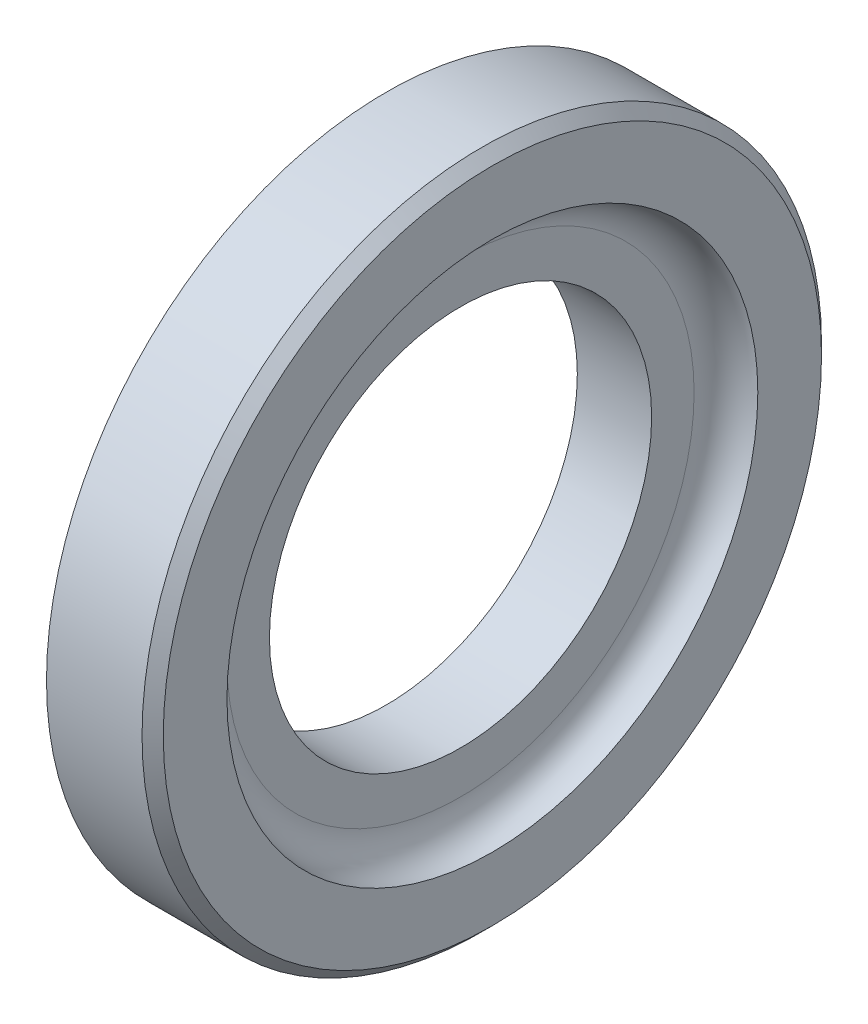
ISO-10303-21;
HEADER;
FILE_DESCRIPTION(('STEP AP214'),'2;1');
FILE_NAME('part.step','',(''),(''),'','','');
FILE_SCHEMA(('AUTOMOTIVE_DESIGN { 1 0 10303 214 1 1 1 1 }'));
ENDSEC;
DATA;
#1=APPLICATION_CONTEXT('core data for automotive mechanical design processes');
#2=APPLICATION_PROTOCOL_DEFINITION('international standard','automotive_design',2000,#1);
#3=PRODUCT_CONTEXT('',#1,'mechanical');
#4=PRODUCT('Part','Part','',(#3));
#5=PRODUCT_RELATED_PRODUCT_CATEGORY('part','',(#4));
#6=PRODUCT_DEFINITION_FORMATION('','',#4);
#7=PRODUCT_DEFINITION_CONTEXT('part definition',#1,'design');
#8=PRODUCT_DEFINITION('design','',#6,#7);
#9=PRODUCT_DEFINITION_SHAPE('','',#8);
#10=(LENGTH_UNIT() NAMED_UNIT(*) SI_UNIT(.MILLI.,.METRE.));
#11=(NAMED_UNIT(*) PLANE_ANGLE_UNIT() SI_UNIT($,.RADIAN.));
#12=(NAMED_UNIT(*) SI_UNIT($,.STERADIAN.) SOLID_ANGLE_UNIT());
#13=UNCERTAINTY_MEASURE_WITH_UNIT(LENGTH_MEASURE(1.E-05),#10,'distance_accuracy_value','');
#14=(GEOMETRIC_REPRESENTATION_CONTEXT(3) GLOBAL_UNCERTAINTY_ASSIGNED_CONTEXT((#13)) GLOBAL_UNIT_ASSIGNED_CONTEXT((#10,
#11,#12)) REPRESENTATION_CONTEXT('',''));
#15=CARTESIAN_POINT('',(0.,0.,0.));
#16=DIRECTION('',(0.,0.,1.));
#17=DIRECTION('',(1.,0.,0.));
#18=AXIS2_PLACEMENT_3D('',#15,#16,#17);
#19=CARTESIAN_POINT('',(0.,0.,0.));
#20=DIRECTION('',(1.,0.,0.));
#21=DIRECTION('',(0.,0.,-1.));
#22=AXIS2_PLACEMENT_3D('',#19,#20,#21);
#23=PLANE('',#22);
#24=CARTESIAN_POINT('',(0.,0.,0.));
#25=DIRECTION('',(1.,0.,0.));
#26=DIRECTION('',(0.,0.,-1.));
#27=AXIS2_PLACEMENT_3D('',#24,#25,#26);
#28=CIRCLE('',#27,31.);
#29=CARTESIAN_POINT('',(0.,0.,-31.));
#30=VERTEX_POINT('',#29);
#31=EDGE_CURVE('E61',#30,#30,#28,.T.);
#32=ORIENTED_EDGE('',*,*,#31,.T.);
#33=EDGE_LOOP('',(#32));
#34=FACE_BOUND('',#33,.T.);
#35=CARTESIAN_POINT('',(0.,0.,0.));
#36=DIRECTION('',(1.,0.,0.));
#37=DIRECTION('',(0.,0.,-1.));
#38=AXIS2_PLACEMENT_3D('',#35,#36,#37);
#39=CIRCLE('',#38,25.);
#40=CARTESIAN_POINT('',(0.,0.,-25.));
#41=VERTEX_POINT('',#40);
#42=EDGE_CURVE('E115',#41,#41,#39,.T.);
#43=ORIENTED_EDGE('',*,*,#42,.F.);
#44=EDGE_LOOP('',(#43));
#45=FACE_BOUND('',#44,.T.);
#46=ADVANCED_FACE('F51',(#34,#45),#23,.T.);
#47=CARTESIAN_POINT('',(0.,0.,0.));
#48=DIRECTION('',(1.,0.,0.));
#49=DIRECTION('',(0.,0.,-1.));
#50=AXIS2_PLACEMENT_3D('',#47,#48,#49);
#51=CYLINDRICAL_SURFACE('',#50,32.);
#52=CARTESIAN_POINT('',(-1.00000000000004,0.,0.));
#53=DIRECTION('',(1.,0.,0.));
#54=DIRECTION('',(0.,0.,-1.));
#55=AXIS2_PLACEMENT_3D('',#52,#53,#54);
#56=CIRCLE('',#55,32.);
#57=CARTESIAN_POINT('',(-1.00000000000004,0.,-32.));
#58=VERTEX_POINT('',#57);
#59=EDGE_CURVE('E11',#58,#58,#56,.F.);
#60=ORIENTED_EDGE('',*,*,#59,.T.);
#61=EDGE_LOOP('',(#60));
#62=FACE_BOUND('',#61,.T.);
#63=CARTESIAN_POINT('',(-10.,0.,0.));
#64=DIRECTION('',(1.,0.,0.));
#65=DIRECTION('',(0.,0.,-1.));
#66=AXIS2_PLACEMENT_3D('',#63,#64,#65);
#67=CIRCLE('',#66,32.);
#68=CARTESIAN_POINT('',(-10.,0.,-32.));
#69=VERTEX_POINT('',#68);
#70=EDGE_CURVE('E119',#69,#69,#67,.T.);
#71=ORIENTED_EDGE('',*,*,#70,.T.);
#72=EDGE_LOOP('',(#71));
#73=FACE_BOUND('',#72,.T.);
#74=ADVANCED_FACE('F144',(#62,#73),#51,.T.);
#75=CARTESIAN_POINT('',(-10.,0.,0.));
#76=DIRECTION('',(-1.,0.,0.));
#77=DIRECTION('',(0.,0.,1.));
#78=AXIS2_PLACEMENT_3D('',#75,#76,#77);
#79=PLANE('',#78);
#80=CARTESIAN_POINT('',(-10.,0.,25.));
#81=DIRECTION('',(-1.,0.,0.));
#82=DIRECTION('',(0.,-1.,0.));
#83=AXIS2_PLACEMENT_3D('',#80,#81,#82);
#84=CIRCLE('',#83,1.5);
#85=CARTESIAN_POINT('',(-10.,-1.50000000000009,25.));
#86=VERTEX_POINT('',#85);
#87=EDGE_CURVE('E200',#86,#86,#84,.T.);
#88=ORIENTED_EDGE('',*,*,#87,.F.);
#89=EDGE_LOOP('',(#88));
#90=FACE_BOUND('',#89,.T.);
#91=CARTESIAN_POINT('',(-10.,-25.,0.));
#92=DIRECTION('',(-1.,0.,0.));
#93=DIRECTION('',(0.,0.,-1.));
#94=AXIS2_PLACEMENT_3D('',#91,#92,#93);
#95=CIRCLE('',#94,1.5);
#96=CARTESIAN_POINT('',(-10.,-25.,-1.5));
#97=VERTEX_POINT('',#96);
#98=EDGE_CURVE('E85',#97,#97,#95,.T.);
#99=ORIENTED_EDGE('',*,*,#98,.F.);
#100=EDGE_LOOP('',(#99));
#101=FACE_BOUND('',#100,.T.);
#102=CARTESIAN_POINT('',(-10.,2.61861100413235E-13,-25.));
#103=DIRECTION('',(-1.,0.,0.));
#104=DIRECTION('',(0.,1.,0.));
#105=AXIS2_PLACEMENT_3D('',#102,#103,#104);
#106=CIRCLE('',#105,1.5);
#107=CARTESIAN_POINT('',(-10.,1.50000000000026,-25.));
#108=VERTEX_POINT('',#107);
#109=EDGE_CURVE('E86',#108,#108,#106,.T.);
#110=ORIENTED_EDGE('',*,*,#109,.F.);
#111=EDGE_LOOP('',(#110));
#112=FACE_BOUND('',#111,.T.);
#113=CARTESIAN_POINT('',(-10.,25.,0.));
#114=DIRECTION('',(-1.,0.,0.));
#115=DIRECTION('',(0.,0.,1.));
#116=AXIS2_PLACEMENT_3D('',#113,#114,#115);
#117=CIRCLE('',#116,1.5);
#118=CARTESIAN_POINT('',(-10.,25.,1.5));
#119=VERTEX_POINT('',#118);
#120=EDGE_CURVE('E98',#119,#119,#117,.T.);
#121=ORIENTED_EDGE('',*,*,#120,.F.);
#122=EDGE_LOOP('',(#121));
#123=FACE_BOUND('',#122,.T.);
#124=CARTESIAN_POINT('',(-10.,0.,0.));
#125=DIRECTION('',(1.,0.,0.));
#126=DIRECTION('',(0.,0.,-1.));
#127=AXIS2_PLACEMENT_3D('',#124,#125,#126);
#128=CIRCLE('',#127,18.);
#129=CARTESIAN_POINT('',(-10.,0.,-18.));
#130=VERTEX_POINT('',#129);
#131=EDGE_CURVE('E107',#130,#130,#128,.T.);
#132=ORIENTED_EDGE('',*,*,#131,.T.);
#133=EDGE_LOOP('',(#132));
#134=FACE_BOUND('',#133,.T.);
#135=ORIENTED_EDGE('',*,*,#70,.F.);
#136=EDGE_LOOP('',(#135));
#137=FACE_BOUND('',#136,.T.);
#138=ADVANCED_FACE('F149',(#90,#101,#112,#123,#134,#137),#79,.T.);
#139=CARTESIAN_POINT('',(-3.00000000000001,25.,0.));
#140=DIRECTION('',(-1.,0.,0.));
#141=DIRECTION('',(0.,0.,1.));
#142=AXIS2_PLACEMENT_3D('',#139,#140,#141);
#143=PLANE('',#142);
#144=CARTESIAN_POINT('',(-3.00000000000001,0.,0.));
#145=DIRECTION('',(-1.,0.,0.));
#146=DIRECTION('',(0.,0.,1.));
#147=AXIS2_PLACEMENT_3D('',#144,#145,#146);
#148=CIRCLE('',#147,22.);
#149=CARTESIAN_POINT('',(-3.00000000000001,0.,22.));
#150=VERTEX_POINT('',#149);
#151=EDGE_CURVE('E123',#150,#150,#148,.F.);
#152=ORIENTED_EDGE('',*,*,#151,.T.);
#153=EDGE_LOOP('',(#152));
#154=FACE_BOUND('',#153,.T.);
#155=CARTESIAN_POINT('',(-3.00000000000001,0.,0.));
#156=DIRECTION('',(1.,0.,0.));
#157=DIRECTION('',(0.,0.,-1.));
#158=AXIS2_PLACEMENT_3D('',#155,#156,#157);
#159=CIRCLE('',#158,18.);
#160=CARTESIAN_POINT('',(-3.00000000000001,0.,-18.));
#161=VERTEX_POINT('',#160);
#162=EDGE_CURVE('E111',#161,#161,#159,.T.);
#163=ORIENTED_EDGE('',*,*,#162,.F.);
#164=EDGE_LOOP('',(#163));
#165=FACE_BOUND('',#164,.T.);
#166=ADVANCED_FACE('F163',(#154,#165),#143,.F.);
#167=CARTESIAN_POINT('',(0.,0.,0.));
#168=DIRECTION('',(1.,0.,0.));
#169=DIRECTION('',(0.,0.,-1.));
#170=AXIS2_PLACEMENT_3D('',#167,#168,#169);
#171=CYLINDRICAL_SURFACE('',#170,18.);
#172=ORIENTED_EDGE('',*,*,#131,.F.);
#173=EDGE_LOOP('',(#172));
#174=FACE_BOUND('',#173,.T.);
#175=ORIENTED_EDGE('',*,*,#162,.T.);
#176=EDGE_LOOP('',(#175));
#177=FACE_BOUND('',#176,.T.);
#178=ADVANCED_FACE('F156',(#174,#177),#171,.F.);
#179=CARTESIAN_POINT('',(0.,0.,0.));
#180=DIRECTION('',(-1.,0.,0.));
#181=DIRECTION('',(0.,0.,1.));
#182=AXIS2_PLACEMENT_3D('',#179,#180,#181);
#183=TOROIDAL_SURFACE('',#182,22.,3.);
#184=ORIENTED_EDGE('',*,*,#42,.T.);
#185=EDGE_LOOP('',(#184));
#186=FACE_BOUND('',#185,.T.);
#187=ORIENTED_EDGE('',*,*,#151,.F.);
#188=EDGE_LOOP('',(#187));
#189=FACE_BOUND('',#188,.T.);
#190=ADVANCED_FACE('F153',(#186,#189),#183,.F.);
#191=CARTESIAN_POINT('',(-7.,25.,0.));
#192=DIRECTION('',(-1.,0.,0.));
#193=DIRECTION('',(0.,0.,1.));
#194=AXIS2_PLACEMENT_3D('',#191,#192,#193);
#195=CONICAL_SURFACE('',#194,1.5,1.02974425867665);
#196=CARTESIAN_POINT('',(-6.09870907145866,25.,0.));
#197=VERTEX_POINT('',#196);
#198=VERTEX_LOOP('',#197);
#199=FACE_BOUND('',#198,.T.);
#200=CARTESIAN_POINT('',(-7.,25.,0.));
#201=DIRECTION('',(-1.,0.,0.));
#202=DIRECTION('',(0.,0.,1.));
#203=AXIS2_PLACEMENT_3D('',#200,#201,#202);
#204=CIRCLE('',#203,1.5);
#205=CARTESIAN_POINT('',(-7.,25.,1.5));
#206=VERTEX_POINT('',#205);
#207=EDGE_CURVE('E102',#206,#206,#204,.T.);
#208=ORIENTED_EDGE('',*,*,#207,.T.);
#209=EDGE_LOOP('',(#208));
#210=FACE_BOUND('',#209,.T.);
#211=ADVANCED_FACE('F155',(#199,#210),#195,.F.);
#212=CARTESIAN_POINT('',(-10.,25.,0.));
#213=DIRECTION('',(-1.,0.,0.));
#214=DIRECTION('',(0.,0.,1.));
#215=AXIS2_PLACEMENT_3D('',#212,#213,#214);
#216=CYLINDRICAL_SURFACE('',#215,1.5);
#217=ORIENTED_EDGE('',*,*,#207,.F.);
#218=EDGE_LOOP('',(#217));
#219=FACE_BOUND('',#218,.T.);
#220=ORIENTED_EDGE('',*,*,#120,.T.);
#221=EDGE_LOOP('',(#220));
#222=FACE_BOUND('',#221,.T.);
#223=ADVANCED_FACE('F78',(#219,#222),#216,.F.);
#224=CARTESIAN_POINT('',(-7.,2.61861100413235E-13,-25.));
#225=DIRECTION('',(-1.,0.,0.));
#226=DIRECTION('',(0.,1.,0.));
#227=AXIS2_PLACEMENT_3D('',#224,#225,#226);
#228=CONICAL_SURFACE('',#227,1.5,1.02974425867665);
#229=CARTESIAN_POINT('',(-6.09870907145866,2.61861100413235E-13,-25.));
#230=VERTEX_POINT('',#229);
#231=VERTEX_LOOP('',#230);
#232=FACE_BOUND('',#231,.T.);
#233=CARTESIAN_POINT('',(-7.,2.61861100413235E-13,-25.));
#234=DIRECTION('',(-1.,0.,0.));
#235=DIRECTION('',(0.,1.,0.));
#236=AXIS2_PLACEMENT_3D('',#233,#234,#235);
#237=CIRCLE('',#236,1.5);
#238=CARTESIAN_POINT('',(-7.,1.50000000000026,-25.));
#239=VERTEX_POINT('',#238);
#240=EDGE_CURVE('E82',#239,#239,#237,.T.);
#241=ORIENTED_EDGE('',*,*,#240,.T.);
#242=EDGE_LOOP('',(#241));
#243=FACE_BOUND('',#242,.T.);
#244=ADVANCED_FACE('F74',(#232,#243),#228,.F.);
#245=CARTESIAN_POINT('',(-10.,2.61861100413235E-13,-25.));
#246=DIRECTION('',(-1.,0.,0.));
#247=DIRECTION('',(0.,1.,0.));
#248=AXIS2_PLACEMENT_3D('',#245,#246,#247);
#249=CYLINDRICAL_SURFACE('',#248,1.5);
#250=ORIENTED_EDGE('',*,*,#240,.F.);
#251=EDGE_LOOP('',(#250));
#252=FACE_BOUND('',#251,.T.);
#253=ORIENTED_EDGE('',*,*,#109,.T.);
#254=EDGE_LOOP('',(#253));
#255=FACE_BOUND('',#254,.T.);
#256=ADVANCED_FACE('F77',(#252,#255),#249,.F.);
#257=CARTESIAN_POINT('',(-7.,-25.,0.));
#258=DIRECTION('',(-1.,0.,0.));
#259=DIRECTION('',(0.,0.,-1.));
#260=AXIS2_PLACEMENT_3D('',#257,#258,#259);
#261=CONICAL_SURFACE('',#260,1.5,1.02974425867665);
#262=CARTESIAN_POINT('',(-6.09870907145866,-25.,0.));
#263=VERTEX_POINT('',#262);
#264=VERTEX_LOOP('',#263);
#265=FACE_BOUND('',#264,.T.);
#266=CARTESIAN_POINT('',(-7.,-25.,0.));
#267=DIRECTION('',(-1.,0.,0.));
#268=DIRECTION('',(0.,0.,-1.));
#269=AXIS2_PLACEMENT_3D('',#266,#267,#268);
#270=CIRCLE('',#269,1.5);
#271=CARTESIAN_POINT('',(-7.,-25.,-1.5));
#272=VERTEX_POINT('',#271);
#273=EDGE_CURVE('E92',#272,#272,#270,.T.);
#274=ORIENTED_EDGE('',*,*,#273,.T.);
#275=EDGE_LOOP('',(#274));
#276=FACE_BOUND('',#275,.T.);
#277=ADVANCED_FACE('F185',(#265,#276),#261,.F.);
#278=CARTESIAN_POINT('',(-10.,-25.,0.));
#279=DIRECTION('',(-1.,0.,0.));
#280=DIRECTION('',(0.,0.,-1.));
#281=AXIS2_PLACEMENT_3D('',#278,#279,#280);
#282=CYLINDRICAL_SURFACE('',#281,1.5);
#283=ORIENTED_EDGE('',*,*,#273,.F.);
#284=EDGE_LOOP('',(#283));
#285=FACE_BOUND('',#284,.T.);
#286=ORIENTED_EDGE('',*,*,#98,.T.);
#287=EDGE_LOOP('',(#286));
#288=FACE_BOUND('',#287,.T.);
#289=ADVANCED_FACE('F188',(#285,#288),#282,.F.);
#290=CARTESIAN_POINT('',(-7.,0.,25.));
#291=DIRECTION('',(-1.,0.,0.));
#292=DIRECTION('',(0.,-1.,0.));
#293=AXIS2_PLACEMENT_3D('',#290,#291,#292);
#294=CONICAL_SURFACE('',#293,1.5,1.02974425867665);
#295=CARTESIAN_POINT('',(-6.09870907145866,0.,25.));
#296=VERTEX_POINT('',#295);
#297=VERTEX_LOOP('',#296);
#298=FACE_BOUND('',#297,.T.);
#299=CARTESIAN_POINT('',(-7.,0.,25.));
#300=DIRECTION('',(-1.,0.,0.));
#301=DIRECTION('',(0.,-1.,0.));
#302=AXIS2_PLACEMENT_3D('',#299,#300,#301);
#303=CIRCLE('',#302,1.5);
#304=CARTESIAN_POINT('',(-7.,-1.50000000000009,25.));
#305=VERTEX_POINT('',#304);
#306=EDGE_CURVE('E103',#305,#305,#303,.T.);
#307=ORIENTED_EDGE('',*,*,#306,.T.);
#308=EDGE_LOOP('',(#307));
#309=FACE_BOUND('',#308,.T.);
#310=ADVANCED_FACE('F139',(#298,#309),#294,.F.);
#311=CARTESIAN_POINT('',(-10.,0.,25.));
#312=DIRECTION('',(-1.,0.,0.));
#313=DIRECTION('',(0.,-1.,0.));
#314=AXIS2_PLACEMENT_3D('',#311,#312,#313);
#315=CYLINDRICAL_SURFACE('',#314,1.5);
#316=ORIENTED_EDGE('',*,*,#306,.F.);
#317=EDGE_LOOP('',(#316));
#318=FACE_BOUND('',#317,.T.);
#319=ORIENTED_EDGE('',*,*,#87,.T.);
#320=EDGE_LOOP('',(#319));
#321=FACE_BOUND('',#320,.T.);
#322=ADVANCED_FACE('F134',(#318,#321),#315,.F.);
#323=CARTESIAN_POINT('',(0.,0.,0.));
#324=DIRECTION('',(-1.,0.,0.));
#325=DIRECTION('',(0.,0.,1.));
#326=AXIS2_PLACEMENT_3D('',#323,#324,#325);
#327=CONICAL_SURFACE('',#326,31.,0.785398163397441);
#328=ORIENTED_EDGE('',*,*,#59,.F.);
#329=EDGE_LOOP('',(#328));
#330=FACE_BOUND('',#329,.T.);
#331=ORIENTED_EDGE('',*,*,#31,.F.);
#332=EDGE_LOOP('',(#331));
#333=FACE_BOUND('',#332,.T.);
#334=ADVANCED_FACE('F54',(#330,#333),#327,.T.);
#335=CLOSED_SHELL('',(#46,#74,#138,#166,#178,#190,#211,#223,#244,#256,#277,#289,#310,#322,#334));
#336=MANIFOLD_SOLID_BREP('B2',#335);
#337=ADVANCED_BREP_SHAPE_REPRESENTATION('',(#18,#336),#14);
#338=SHAPE_DEFINITION_REPRESENTATION(#9,#337);
ENDSEC;
END-ISO-10303-21;
